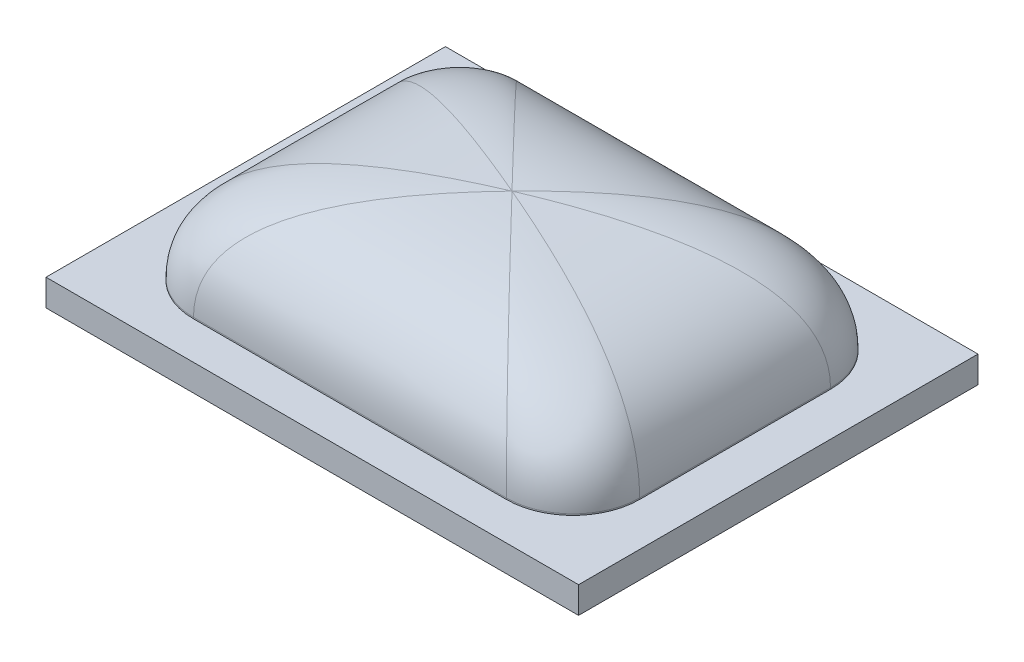
ISO-10303-21;
HEADER;
FILE_DESCRIPTION(('STEP AP214'),'2;1');
FILE_NAME('part.step','',(''),(''),'','','');
FILE_SCHEMA(('AUTOMOTIVE_DESIGN { 1 0 10303 214 1 1 1 1 }'));
ENDSEC;
DATA;
#1=APPLICATION_CONTEXT('core data for automotive mechanical design processes');
#2=APPLICATION_PROTOCOL_DEFINITION('international standard','automotive_design',2000,#1);
#3=PRODUCT_CONTEXT('',#1,'mechanical');
#4=PRODUCT('Part','Part','',(#3));
#5=PRODUCT_RELATED_PRODUCT_CATEGORY('part','',(#4));
#6=PRODUCT_DEFINITION_FORMATION('','',#4);
#7=PRODUCT_DEFINITION_CONTEXT('part definition',#1,'design');
#8=PRODUCT_DEFINITION('design','',#6,#7);
#9=PRODUCT_DEFINITION_SHAPE('','',#8);
#10=(LENGTH_UNIT() NAMED_UNIT(*) SI_UNIT(.MILLI.,.METRE.));
#11=(NAMED_UNIT(*) PLANE_ANGLE_UNIT() SI_UNIT($,.RADIAN.));
#12=(NAMED_UNIT(*) SI_UNIT($,.STERADIAN.) SOLID_ANGLE_UNIT());
#13=UNCERTAINTY_MEASURE_WITH_UNIT(LENGTH_MEASURE(1.E-05),#10,'distance_accuracy_value','');
#14=(GEOMETRIC_REPRESENTATION_CONTEXT(3) GLOBAL_UNCERTAINTY_ASSIGNED_CONTEXT((#13)) GLOBAL_UNIT_ASSIGNED_CONTEXT((#10,
#11,#12)) REPRESENTATION_CONTEXT('',''));
#15=CARTESIAN_POINT('',(0.,0.,0.));
#16=DIRECTION('',(0.,0.,1.));
#17=DIRECTION('',(1.,0.,0.));
#18=AXIS2_PLACEMENT_3D('',#15,#16,#17);
#19=CARTESIAN_POINT('',(0.,0.2,0.));
#20=DIRECTION('',(0.,1.,0.));
#21=DIRECTION('',(0.,0.,1.));
#22=AXIS2_PLACEMENT_3D('',#19,#20,#21);
#23=PLANE('',#22);
#24=DIRECTION('',(0.,0.,-1.));
#25=VECTOR('',#24,1.);
#26=CARTESIAN_POINT('',(2.,0.2,-1.5));
#27=LINE('',#26,#25);
#28=CARTESIAN_POINT('',(2.,0.2,1.5));
#29=VERTEX_POINT('',#28);
#30=CARTESIAN_POINT('',(2.,0.2,-1.5));
#31=VERTEX_POINT('',#30);
#32=EDGE_CURVE('E267',#29,#31,#27,.T.);
#33=ORIENTED_EDGE('',*,*,#32,.T.);
#34=DIRECTION('',(-1.,0.,0.));
#35=VECTOR('',#34,1.);
#36=CARTESIAN_POINT('',(-2.,0.2,-1.5));
#37=LINE('',#36,#35);
#38=CARTESIAN_POINT('',(-2.,0.2,-1.5));
#39=VERTEX_POINT('',#38);
#40=EDGE_CURVE('E86',#31,#39,#37,.T.);
#41=ORIENTED_EDGE('',*,*,#40,.T.);
#42=DIRECTION('',(0.,0.,1.));
#43=VECTOR('',#42,1.);
#44=CARTESIAN_POINT('',(-2.,0.2,-1.5));
#45=LINE('',#44,#43);
#46=CARTESIAN_POINT('',(-2.,0.2,1.5));
#47=VERTEX_POINT('',#46);
#48=EDGE_CURVE('E270',#39,#47,#45,.T.);
#49=ORIENTED_EDGE('',*,*,#48,.T.);
#50=DIRECTION('',(1.,0.,0.));
#51=VECTOR('',#50,1.);
#52=CARTESIAN_POINT('',(-2.,0.2,1.5));
#53=LINE('',#52,#51);
#54=EDGE_CURVE('E58',#47,#29,#53,.T.);
#55=ORIENTED_EDGE('',*,*,#54,.T.);
#56=EDGE_LOOP('',(#33,#41,#49,#55));
#57=FACE_BOUND('',#56,.T.);
#58=DIRECTION('',(-1.,0.,0.));
#59=VECTOR('',#58,1.);
#60=CARTESIAN_POINT('',(-1.17531980567757,0.2,-1.21705802677086));
#61=LINE('',#60,#59);
#62=CARTESIAN_POINT('',(1.17531980567757,0.2,-1.21705802677086));
#63=VERTEX_POINT('',#62);
#64=CARTESIAN_POINT('',(-1.17531980567757,0.2,-1.21705802677086));
#65=VERTEX_POINT('',#64);
#66=EDGE_CURVE('E155',#63,#65,#61,.T.);
#67=ORIENTED_EDGE('',*,*,#66,.F.);
#68=CARTESIAN_POINT('',(1.17531980567757,0.2,-0.717058026770856));
#69=DIRECTION('',(0.,1.,0.));
#70=DIRECTION('',(0.,0.,-1.));
#71=AXIS2_PLACEMENT_3D('',#68,#69,#70);
#72=CIRCLE('',#71,0.5);
#73=CARTESIAN_POINT('',(1.67531980567757,0.2,-0.717058026770853));
#74=VERTEX_POINT('',#73);
#75=EDGE_CURVE('E216',#74,#63,#72,.T.);
#76=ORIENTED_EDGE('',*,*,#75,.F.);
#77=DIRECTION('',(0.,0.,-1.));
#78=VECTOR('',#77,1.);
#79=CARTESIAN_POINT('',(1.67531980567757,0.2,-0.717058026770853));
#80=LINE('',#79,#78);
#81=CARTESIAN_POINT('',(1.67531980567757,0.2,0.717058026770853));
#82=VERTEX_POINT('',#81);
#83=EDGE_CURVE('E221',#82,#74,#80,.T.);
#84=ORIENTED_EDGE('',*,*,#83,.F.);
#85=CARTESIAN_POINT('',(1.17531980567757,0.2,0.717058026770856));
#86=DIRECTION('',(0.,1.,0.));
#87=DIRECTION('',(0.,0.,1.));
#88=AXIS2_PLACEMENT_3D('',#85,#86,#87);
#89=CIRCLE('',#88,0.5);
#90=CARTESIAN_POINT('',(1.17531980567757,0.2,1.21705802677086));
#91=VERTEX_POINT('',#90);
#92=EDGE_CURVE('E249',#91,#82,#89,.T.);
#93=ORIENTED_EDGE('',*,*,#92,.F.);
#94=DIRECTION('',(1.,0.,0.));
#95=VECTOR('',#94,1.);
#96=CARTESIAN_POINT('',(-1.17531980567757,0.2,1.21705802677086));
#97=LINE('',#96,#95);
#98=CARTESIAN_POINT('',(-1.17531980567757,0.2,1.21705802677086));
#99=VERTEX_POINT('',#98);
#100=EDGE_CURVE('E247',#99,#91,#97,.T.);
#101=ORIENTED_EDGE('',*,*,#100,.F.);
#102=CARTESIAN_POINT('',(-1.17531980567757,0.2,0.717058026770856));
#103=DIRECTION('',(0.,1.,0.));
#104=DIRECTION('',(0.,0.,1.));
#105=AXIS2_PLACEMENT_3D('',#102,#103,#104);
#106=CIRCLE('',#105,0.5);
#107=CARTESIAN_POINT('',(-1.67531980567757,0.2,0.717058026770853));
#108=VERTEX_POINT('',#107);
#109=EDGE_CURVE('E245',#108,#99,#106,.T.);
#110=ORIENTED_EDGE('',*,*,#109,.F.);
#111=DIRECTION('',(0.,0.,1.));
#112=VECTOR('',#111,1.);
#113=CARTESIAN_POINT('',(-1.67531980567757,0.2,-0.717058026770853));
#114=LINE('',#113,#112);
#115=CARTESIAN_POINT('',(-1.67531980567757,0.2,-0.717058026770853));
#116=VERTEX_POINT('',#115);
#117=EDGE_CURVE('E243',#116,#108,#114,.T.);
#118=ORIENTED_EDGE('',*,*,#117,.F.);
#119=CARTESIAN_POINT('',(-1.17531980567757,0.2,-0.717058026770856));
#120=DIRECTION('',(0.,1.,0.));
#121=DIRECTION('',(0.,0.,1.));
#122=AXIS2_PLACEMENT_3D('',#119,#120,#121);
#123=CIRCLE('',#122,0.5);
#124=EDGE_CURVE('E241',#65,#116,#123,.T.);
#125=ORIENTED_EDGE('',*,*,#124,.F.);
#126=EDGE_LOOP('',(#67,#76,#84,#93,#101,#110,#118,#125));
#127=FACE_BOUND('',#126,.T.);
#128=ADVANCED_FACE('F34',(#57,#127),#23,.T.);
#129=CARTESIAN_POINT('',(2.,0.2,-1.5));
#130=DIRECTION('',(-1.,0.,0.));
#131=DIRECTION('',(0.,0.,1.));
#132=AXIS2_PLACEMENT_3D('',#129,#130,#131);
#133=PLANE('',#132);
#134=DIRECTION('',(0.,0.,-1.));
#135=VECTOR('',#134,1.);
#136=CARTESIAN_POINT('',(2.,0.,-1.5));
#137=LINE('',#136,#135);
#138=CARTESIAN_POINT('',(2.,0.,1.5));
#139=VERTEX_POINT('',#138);
#140=CARTESIAN_POINT('',(2.,0.,-1.5));
#141=VERTEX_POINT('',#140);
#142=EDGE_CURVE('E266',#139,#141,#137,.T.);
#143=ORIENTED_EDGE('',*,*,#142,.T.);
#144=DIRECTION('',(0.,-1.,0.));
#145=VECTOR('',#144,1.);
#146=CARTESIAN_POINT('',(2.,0.2,-1.5));
#147=LINE('',#146,#145);
#148=EDGE_CURVE('E11',#31,#141,#147,.T.);
#149=ORIENTED_EDGE('',*,*,#148,.F.);
#150=ORIENTED_EDGE('',*,*,#32,.F.);
#151=DIRECTION('',(0.,-1.,0.));
#152=VECTOR('',#151,1.);
#153=CARTESIAN_POINT('',(2.,0.2,1.5));
#154=LINE('',#153,#152);
#155=EDGE_CURVE('E273',#29,#139,#154,.T.);
#156=ORIENTED_EDGE('',*,*,#155,.T.);
#157=EDGE_LOOP('',(#143,#149,#150,#156));
#158=FACE_BOUND('',#157,.T.);
#159=ADVANCED_FACE('F36',(#158),#133,.F.);
#160=CARTESIAN_POINT('',(-2.,0.2,-1.5));
#161=DIRECTION('',(0.,0.,1.));
#162=DIRECTION('',(1.,0.,0.));
#163=AXIS2_PLACEMENT_3D('',#160,#161,#162);
#164=PLANE('',#163);
#165=DIRECTION('',(-1.,0.,0.));
#166=VECTOR('',#165,1.);
#167=CARTESIAN_POINT('',(-2.,0.,-1.5));
#168=LINE('',#167,#166);
#169=CARTESIAN_POINT('',(-2.,0.,-1.5));
#170=VERTEX_POINT('',#169);
#171=EDGE_CURVE('E276',#141,#170,#168,.T.);
#172=ORIENTED_EDGE('',*,*,#171,.T.);
#173=DIRECTION('',(0.,-1.,0.));
#174=VECTOR('',#173,1.);
#175=CARTESIAN_POINT('',(-2.,0.2,-1.5));
#176=LINE('',#175,#174);
#177=EDGE_CURVE('E42',#39,#170,#176,.T.);
#178=ORIENTED_EDGE('',*,*,#177,.F.);
#179=ORIENTED_EDGE('',*,*,#40,.F.);
#180=ORIENTED_EDGE('',*,*,#148,.T.);
#181=EDGE_LOOP('',(#172,#178,#179,#180));
#182=FACE_BOUND('',#181,.T.);
#183=ADVANCED_FACE('F304',(#182),#164,.F.);
#184=CARTESIAN_POINT('',(-2.,0.2,-1.5));
#185=DIRECTION('',(1.,0.,0.));
#186=DIRECTION('',(0.,0.,-1.));
#187=AXIS2_PLACEMENT_3D('',#184,#185,#186);
#188=PLANE('',#187);
#189=DIRECTION('',(0.,0.,1.));
#190=VECTOR('',#189,1.);
#191=CARTESIAN_POINT('',(-2.,0.,-1.5));
#192=LINE('',#191,#190);
#193=CARTESIAN_POINT('',(-2.,0.,1.5));
#194=VERTEX_POINT('',#193);
#195=EDGE_CURVE('E278',#170,#194,#192,.T.);
#196=ORIENTED_EDGE('',*,*,#195,.T.);
#197=DIRECTION('',(0.,-1.,0.));
#198=VECTOR('',#197,1.);
#199=CARTESIAN_POINT('',(-2.,0.2,1.5));
#200=LINE('',#199,#198);
#201=EDGE_CURVE('E282',#47,#194,#200,.T.);
#202=ORIENTED_EDGE('',*,*,#201,.F.);
#203=ORIENTED_EDGE('',*,*,#48,.F.);
#204=ORIENTED_EDGE('',*,*,#177,.T.);
#205=EDGE_LOOP('',(#196,#202,#203,#204));
#206=FACE_BOUND('',#205,.T.);
#207=ADVANCED_FACE('F287',(#206),#188,.F.);
#208=CARTESIAN_POINT('',(-2.,0.2,1.5));
#209=DIRECTION('',(0.,0.,-1.));
#210=DIRECTION('',(-1.,0.,0.));
#211=AXIS2_PLACEMENT_3D('',#208,#209,#210);
#212=PLANE('',#211);
#213=DIRECTION('',(1.,0.,0.));
#214=VECTOR('',#213,1.);
#215=CARTESIAN_POINT('',(-2.,0.,1.5));
#216=LINE('',#215,#214);
#217=EDGE_CURVE('E79',#194,#139,#216,.T.);
#218=ORIENTED_EDGE('',*,*,#217,.T.);
#219=ORIENTED_EDGE('',*,*,#155,.F.);
#220=ORIENTED_EDGE('',*,*,#54,.F.);
#221=ORIENTED_EDGE('',*,*,#201,.T.);
#222=EDGE_LOOP('',(#218,#219,#220,#221));
#223=FACE_BOUND('',#222,.T.);
#224=ADVANCED_FACE('F295',(#223),#212,.F.);
#225=CARTESIAN_POINT('',(0.,0.,0.));
#226=DIRECTION('',(0.,1.,0.));
#227=DIRECTION('',(0.,0.,1.));
#228=AXIS2_PLACEMENT_3D('',#225,#226,#227);
#229=PLANE('',#228);
#230=ORIENTED_EDGE('',*,*,#142,.F.);
#231=ORIENTED_EDGE('',*,*,#217,.F.);
#232=ORIENTED_EDGE('',*,*,#195,.F.);
#233=ORIENTED_EDGE('',*,*,#171,.F.);
#234=EDGE_LOOP('',(#230,#231,#232,#233));
#235=FACE_BOUND('',#234,.T.);
#236=ADVANCED_FACE('F291',(#235),#229,.F.);
#237=CARTESIAN_POINT('',(1.17531980567757,0.21,-0.717058026770856));
#238=DIRECTION('',(0.,-1.,0.));
#239=DIRECTION('',(0.,0.,-1.));
#240=AXIS2_PLACEMENT_3D('',#237,#238,#239);
#241=CYLINDRICAL_SURFACE('',#240,0.5);
#242=ORIENTED_EDGE('',*,*,#75,.T.);
#243=DIRECTION('',(0.,-1.,0.));
#244=VECTOR('',#243,1.);
#245=CARTESIAN_POINT('',(1.17531980567757,0.21,-1.21705802677086));
#246=LINE('',#245,#244);
#247=CARTESIAN_POINT('',(1.17531980567757,0.21,-1.21705802677086));
#248=VERTEX_POINT('',#247);
#249=EDGE_CURVE('E156',#248,#63,#246,.T.);
#250=ORIENTED_EDGE('',*,*,#249,.F.);
#251=CARTESIAN_POINT('',(1.17531980567757,0.21,-0.717058026770856));
#252=DIRECTION('',(0.,1.,0.));
#253=DIRECTION('',(0.,0.,-1.));
#254=AXIS2_PLACEMENT_3D('',#251,#252,#253);
#255=CIRCLE('',#254,0.5);
#256=CARTESIAN_POINT('',(1.67531980567757,0.21,-0.717058026770853));
#257=VERTEX_POINT('',#256);
#258=EDGE_CURVE('E165',#257,#248,#255,.T.);
#259=ORIENTED_EDGE('',*,*,#258,.F.);
#260=DIRECTION('',(0.,-1.,0.));
#261=VECTOR('',#260,1.);
#262=CARTESIAN_POINT('',(1.67531980567757,0.21,-0.717058026770853));
#263=LINE('',#262,#261);
#264=EDGE_CURVE('E237',#257,#74,#263,.T.);
#265=ORIENTED_EDGE('',*,*,#264,.T.);
#266=EDGE_LOOP('',(#242,#250,#259,#265));
#267=FACE_BOUND('',#266,.T.);
#268=ADVANCED_FACE('F302',(#267),#241,.T.);
#269=CARTESIAN_POINT('',(-1.17531980567757,0.21,-1.21705802677086));
#270=DIRECTION('',(0.,0.,1.));
#271=DIRECTION('',(1.,0.,0.));
#272=AXIS2_PLACEMENT_3D('',#269,#270,#271);
#273=PLANE('',#272);
#274=ORIENTED_EDGE('',*,*,#66,.T.);
#275=DIRECTION('',(0.,-1.,0.));
#276=VECTOR('',#275,1.);
#277=CARTESIAN_POINT('',(-1.17531980567757,0.21,-1.21705802677086));
#278=LINE('',#277,#276);
#279=CARTESIAN_POINT('',(-1.17531980567757,0.21,-1.21705802677086));
#280=VERTEX_POINT('',#279);
#281=EDGE_CURVE('E138',#280,#65,#278,.T.);
#282=ORIENTED_EDGE('',*,*,#281,.F.);
#283=DIRECTION('',(-1.,0.,0.));
#284=VECTOR('',#283,1.);
#285=CARTESIAN_POINT('',(-1.17531980567757,0.21,-1.21705802677086));
#286=LINE('',#285,#284);
#287=EDGE_CURVE('E148',#248,#280,#286,.T.);
#288=ORIENTED_EDGE('',*,*,#287,.F.);
#289=ORIENTED_EDGE('',*,*,#249,.T.);
#290=EDGE_LOOP('',(#274,#282,#288,#289));
#291=FACE_BOUND('',#290,.T.);
#292=ADVANCED_FACE('F152',(#291),#273,.F.);
#293=CARTESIAN_POINT('',(-1.17531980567757,0.21,-0.717058026770856));
#294=DIRECTION('',(0.,-1.,0.));
#295=DIRECTION('',(0.,0.,-1.));
#296=AXIS2_PLACEMENT_3D('',#293,#294,#295);
#297=CYLINDRICAL_SURFACE('',#296,0.5);
#298=ORIENTED_EDGE('',*,*,#124,.T.);
#299=DIRECTION('',(0.,-1.,0.));
#300=VECTOR('',#299,1.);
#301=CARTESIAN_POINT('',(-1.67531980567757,0.21,-0.717058026770853));
#302=LINE('',#301,#300);
#303=CARTESIAN_POINT('',(-1.67531980567757,0.21,-0.717058026770853));
#304=VERTEX_POINT('',#303);
#305=EDGE_CURVE('E141',#304,#116,#302,.T.);
#306=ORIENTED_EDGE('',*,*,#305,.F.);
#307=CARTESIAN_POINT('',(-1.17531980567757,0.21,-0.717058026770856));
#308=DIRECTION('',(0.,1.,0.));
#309=DIRECTION('',(0.,0.,1.));
#310=AXIS2_PLACEMENT_3D('',#307,#308,#309);
#311=CIRCLE('',#310,0.5);
#312=EDGE_CURVE('E135',#280,#304,#311,.T.);
#313=ORIENTED_EDGE('',*,*,#312,.F.);
#314=ORIENTED_EDGE('',*,*,#281,.T.);
#315=EDGE_LOOP('',(#298,#306,#313,#314));
#316=FACE_BOUND('',#315,.T.);
#317=ADVANCED_FACE('F137',(#316),#297,.T.);
#318=CARTESIAN_POINT('',(-1.67531980567757,0.21,-0.717058026770853));
#319=DIRECTION('',(1.,0.,0.));
#320=DIRECTION('',(0.,0.,-1.));
#321=AXIS2_PLACEMENT_3D('',#318,#319,#320);
#322=PLANE('',#321);
#323=ORIENTED_EDGE('',*,*,#117,.T.);
#324=DIRECTION('',(0.,-1.,0.));
#325=VECTOR('',#324,1.);
#326=CARTESIAN_POINT('',(-1.67531980567757,0.21,0.717058026770853));
#327=LINE('',#326,#325);
#328=CARTESIAN_POINT('',(-1.67531980567757,0.21,0.717058026770853));
#329=VERTEX_POINT('',#328);
#330=EDGE_CURVE('E261',#329,#108,#327,.T.);
#331=ORIENTED_EDGE('',*,*,#330,.F.);
#332=DIRECTION('',(0.,0.,1.));
#333=VECTOR('',#332,1.);
#334=CARTESIAN_POINT('',(-1.67531980567757,0.21,-0.717058026770853));
#335=LINE('',#334,#333);
#336=EDGE_CURVE('E147',#304,#329,#335,.T.);
#337=ORIENTED_EDGE('',*,*,#336,.F.);
#338=ORIENTED_EDGE('',*,*,#305,.T.);
#339=EDGE_LOOP('',(#323,#331,#337,#338));
#340=FACE_BOUND('',#339,.T.);
#341=ADVANCED_FACE('F320',(#340),#322,.F.);
#342=CARTESIAN_POINT('',(-1.17531980567757,0.21,0.717058026770856));
#343=DIRECTION('',(0.,-1.,0.));
#344=DIRECTION('',(0.,0.,-1.));
#345=AXIS2_PLACEMENT_3D('',#342,#343,#344);
#346=CYLINDRICAL_SURFACE('',#345,0.5);
#347=ORIENTED_EDGE('',*,*,#109,.T.);
#348=DIRECTION('',(0.,-1.,0.));
#349=VECTOR('',#348,1.);
#350=CARTESIAN_POINT('',(-1.17531980567757,0.21,1.21705802677086));
#351=LINE('',#350,#349);
#352=CARTESIAN_POINT('',(-1.17531980567757,0.21,1.21705802677086));
#353=VERTEX_POINT('',#352);
#354=EDGE_CURVE('E258',#353,#99,#351,.T.);
#355=ORIENTED_EDGE('',*,*,#354,.F.);
#356=CARTESIAN_POINT('',(-1.17531980567757,0.21,0.717058026770856));
#357=DIRECTION('',(0.,1.,0.));
#358=DIRECTION('',(0.,0.,1.));
#359=AXIS2_PLACEMENT_3D('',#356,#357,#358);
#360=CIRCLE('',#359,0.5);
#361=EDGE_CURVE('E225',#329,#353,#360,.T.);
#362=ORIENTED_EDGE('',*,*,#361,.F.);
#363=ORIENTED_EDGE('',*,*,#330,.T.);
#364=EDGE_LOOP('',(#347,#355,#362,#363));
#365=FACE_BOUND('',#364,.T.);
#366=ADVANCED_FACE('F323',(#365),#346,.T.);
#367=CARTESIAN_POINT('',(-1.17531980567757,0.21,1.21705802677086));
#368=DIRECTION('',(0.,0.,-1.));
#369=DIRECTION('',(-1.,0.,0.));
#370=AXIS2_PLACEMENT_3D('',#367,#368,#369);
#371=PLANE('',#370);
#372=ORIENTED_EDGE('',*,*,#100,.T.);
#373=DIRECTION('',(0.,-1.,0.));
#374=VECTOR('',#373,1.);
#375=CARTESIAN_POINT('',(1.17531980567757,0.21,1.21705802677086));
#376=LINE('',#375,#374);
#377=CARTESIAN_POINT('',(1.17531980567757,0.21,1.21705802677086));
#378=VERTEX_POINT('',#377);
#379=EDGE_CURVE('E255',#378,#91,#376,.T.);
#380=ORIENTED_EDGE('',*,*,#379,.F.);
#381=DIRECTION('',(1.,0.,0.));
#382=VECTOR('',#381,1.);
#383=CARTESIAN_POINT('',(-1.17531980567757,0.21,1.21705802677086));
#384=LINE('',#383,#382);
#385=EDGE_CURVE('E228',#353,#378,#384,.T.);
#386=ORIENTED_EDGE('',*,*,#385,.F.);
#387=ORIENTED_EDGE('',*,*,#354,.T.);
#388=EDGE_LOOP('',(#372,#380,#386,#387));
#389=FACE_BOUND('',#388,.T.);
#390=ADVANCED_FACE('F327',(#389),#371,.F.);
#391=CARTESIAN_POINT('',(1.17531980567757,0.21,0.717058026770856));
#392=DIRECTION('',(0.,-1.,0.));
#393=DIRECTION('',(0.,0.,-1.));
#394=AXIS2_PLACEMENT_3D('',#391,#392,#393);
#395=CYLINDRICAL_SURFACE('',#394,0.5);
#396=ORIENTED_EDGE('',*,*,#92,.T.);
#397=DIRECTION('',(0.,-1.,0.));
#398=VECTOR('',#397,1.);
#399=CARTESIAN_POINT('',(1.67531980567757,0.21,0.717058026770853));
#400=LINE('',#399,#398);
#401=CARTESIAN_POINT('',(1.67531980567757,0.21,0.717058026770853));
#402=VERTEX_POINT('',#401);
#403=EDGE_CURVE('E49',#402,#82,#400,.T.);
#404=ORIENTED_EDGE('',*,*,#403,.F.);
#405=CARTESIAN_POINT('',(1.17531980567757,0.21,0.717058026770856));
#406=DIRECTION('',(0.,1.,0.));
#407=DIRECTION('',(0.,0.,1.));
#408=AXIS2_PLACEMENT_3D('',#405,#406,#407);
#409=CIRCLE('',#408,0.5);
#410=EDGE_CURVE('E231',#378,#402,#409,.T.);
#411=ORIENTED_EDGE('',*,*,#410,.F.);
#412=ORIENTED_EDGE('',*,*,#379,.T.);
#413=EDGE_LOOP('',(#396,#404,#411,#412));
#414=FACE_BOUND('',#413,.T.);
#415=ADVANCED_FACE('F331',(#414),#395,.T.);
#416=CARTESIAN_POINT('',(1.67531980567757,0.21,-0.717058026770853));
#417=DIRECTION('',(-1.,0.,0.));
#418=DIRECTION('',(0.,0.,1.));
#419=AXIS2_PLACEMENT_3D('',#416,#417,#418);
#420=PLANE('',#419);
#421=ORIENTED_EDGE('',*,*,#83,.T.);
#422=ORIENTED_EDGE('',*,*,#264,.F.);
#423=DIRECTION('',(0.,0.,-1.));
#424=VECTOR('',#423,1.);
#425=CARTESIAN_POINT('',(1.67531980567757,0.21,-0.717058026770853));
#426=LINE('',#425,#424);
#427=EDGE_CURVE('E234',#402,#257,#426,.T.);
#428=ORIENTED_EDGE('',*,*,#427,.F.);
#429=ORIENTED_EDGE('',*,*,#403,.T.);
#430=EDGE_LOOP('',(#421,#422,#428,#429));
#431=FACE_BOUND('',#430,.T.);
#432=ADVANCED_FACE('F335',(#431),#420,.F.);
#433=CARTESIAN_POINT('',(1.67531980567757,0.21,-0.717058026770853));
#434=CARTESIAN_POINT('',(1.67531980567757,1.01,-0.717058026770853));
#435=CARTESIAN_POINT('',(0.,1.01,0.));
#436=CARTESIAN_POINT('',(1.67531980567757,0.21,-1.00995124558431));
#437=CARTESIAN_POINT('',(1.67531980567757,1.01,-1.00995124558431));
#438=CARTESIAN_POINT('',(0.,1.01,0.));
#439=CARTESIAN_POINT('',(1.46821302449102,0.21,-1.21705802677086));
#440=CARTESIAN_POINT('',(1.46821302449102,1.01,-1.21705802677086));
#441=CARTESIAN_POINT('',(0.,1.01,0.));
#442=CARTESIAN_POINT('',(1.17531980567757,0.21,-1.21705802677086));
#443=CARTESIAN_POINT('',(1.17531980567757,1.01,-1.21705802677086));
#444=CARTESIAN_POINT('',(0.,1.01,0.));
#445=(BOUNDED_SURFACE() B_SPLINE_SURFACE(3,2,((#433,#434,#435),(#436,#437,#438),(#439,#440,
#441),(#442,#443,#444)),.UNSPECIFIED.,.F.,.F.,.F.) B_SPLINE_SURFACE_WITH_KNOTS((4,4),(3,3),(0.,
1.),(0.,1.),.UNSPECIFIED.) GEOMETRIC_REPRESENTATION_ITEM() RATIONAL_B_SPLINE_SURFACE(((1.,1.,
1.),(0.804737854124363,0.804737854124363,0.804737854124363),(0.804737854124363,
0.804737854124363,0.804737854124363),(1.,1.,1.))) REPRESENTATION_ITEM('') SURFACE());
#446=CARTESIAN_POINT('',(1.17531980567757,0.21,-1.21705802677086));
#447=CARTESIAN_POINT('',(1.17531980567757,1.01,-1.21705802677086));
#448=CARTESIAN_POINT('',(0.,1.01,0.));
#449=(BOUNDED_CURVE() B_SPLINE_CURVE(2,(#446,#447,#448),.UNSPECIFIED.,.F.,
.F.) B_SPLINE_CURVE_WITH_KNOTS((3,3),(0.,1.),
.UNSPECIFIED.) CURVE() GEOMETRIC_REPRESENTATION_ITEM() RATIONAL_B_SPLINE_CURVE((1.,1.,1.)) REPRESENTATION_ITEM(''));
#450=CARTESIAN_POINT('',(0.,1.01,0.));
#451=VERTEX_POINT('',#450);
#452=EDGE_CURVE('E164',#248,#451,#449,.T.);
#453=CARTESIAN_POINT('',(1.67531980567757,0.21,-0.717058026770853));
#454=CARTESIAN_POINT('',(1.67531980567757,1.01,-0.717058026770853));
#455=CARTESIAN_POINT('',(0.,1.01,0.));
#456=(BOUNDED_CURVE() B_SPLINE_CURVE(2,(#453,#454,#455),.UNSPECIFIED.,.F.,
.F.) B_SPLINE_CURVE_WITH_KNOTS((3,3),(0.,1.),
.UNSPECIFIED.) CURVE() GEOMETRIC_REPRESENTATION_ITEM() RATIONAL_B_SPLINE_CURVE((1.,1.,1.)) REPRESENTATION_ITEM(''));
#457=EDGE_CURVE('E173',#451,#257,#456,.F.);
#458=ORIENTED_EDGE('',*,*,#258,.T.);
#459=ORIENTED_EDGE('',*,*,#452,.T.);
#460=ORIENTED_EDGE('',*,*,#457,.T.);
#461=EDGE_LOOP('',(#458,#459,#460));
#462=FACE_BOUND('',#461,.T.);
#463=ADVANCED_FACE('F339',(#462),#445,.T.);
#464=CARTESIAN_POINT('',(1.17531980567757,0.21,-1.21705802677086));
#465=CARTESIAN_POINT('',(1.17531980567757,1.01,-1.21705802677086));
#466=CARTESIAN_POINT('',(0.,1.01,0.));
#467=CARTESIAN_POINT('',(-1.17531980567757,0.21,-1.21705802677086));
#468=CARTESIAN_POINT('',(-1.17531980567757,1.01,-1.21705802677086));
#469=CARTESIAN_POINT('',(0.,1.01,0.));
#470=(BOUNDED_SURFACE() B_SPLINE_SURFACE(1,2,((#464,#465,#466),(#467,#468,#469)),.UNSPECIFIED.,
.F.,.F.,.F.) B_SPLINE_SURFACE_WITH_KNOTS((2,2),(3,3),(0.,1.),(0.,1.),
.UNSPECIFIED.) GEOMETRIC_REPRESENTATION_ITEM() RATIONAL_B_SPLINE_SURFACE(((1.,1.,1.),(1.,1.,1.))) REPRESENTATION_ITEM('') SURFACE());
#471=CARTESIAN_POINT('',(-1.17531980567757,0.21,-1.21705802677086));
#472=CARTESIAN_POINT('',(-1.17531980567757,1.01,-1.21705802677086));
#473=CARTESIAN_POINT('',(0.,1.01,0.));
#474=(BOUNDED_CURVE() B_SPLINE_CURVE(2,(#471,#472,#473),.UNSPECIFIED.,.F.,
.F.) B_SPLINE_CURVE_WITH_KNOTS((3,3),(0.,1.),
.UNSPECIFIED.) CURVE() GEOMETRIC_REPRESENTATION_ITEM() RATIONAL_B_SPLINE_CURVE((1.,1.,1.)) REPRESENTATION_ITEM(''));
#475=EDGE_CURVE('E162',#280,#451,#474,.T.);
#476=ORIENTED_EDGE('',*,*,#287,.T.);
#477=ORIENTED_EDGE('',*,*,#475,.T.);
#478=ORIENTED_EDGE('',*,*,#452,.F.);
#479=EDGE_LOOP('',(#476,#477,#478));
#480=FACE_BOUND('',#479,.T.);
#481=ADVANCED_FACE('F161',(#480),#470,.T.);
#482=CARTESIAN_POINT('',(1.67531980567757,0.21,0.717058026770853));
#483=CARTESIAN_POINT('',(1.67531980567757,1.01,0.717058026770853));
#484=CARTESIAN_POINT('',(0.,1.01,0.));
#485=CARTESIAN_POINT('',(1.67531980567757,0.21,-0.717058026770853));
#486=CARTESIAN_POINT('',(1.67531980567757,1.01,-0.717058026770853));
#487=CARTESIAN_POINT('',(0.,1.01,0.));
#488=(BOUNDED_SURFACE() B_SPLINE_SURFACE(1,2,((#482,#483,#484),(#485,#486,#487)),.UNSPECIFIED.,
.F.,.F.,.F.) B_SPLINE_SURFACE_WITH_KNOTS((2,2),(3,3),(0.,1.),(0.,1.),
.UNSPECIFIED.) GEOMETRIC_REPRESENTATION_ITEM() RATIONAL_B_SPLINE_SURFACE(((1.,1.,1.),(1.,1.,1.))) REPRESENTATION_ITEM('') SURFACE());
#489=CARTESIAN_POINT('',(1.67531980567757,0.21,0.717058026770853));
#490=CARTESIAN_POINT('',(1.67531980567757,1.01,0.717058026770853));
#491=CARTESIAN_POINT('',(0.,1.01,0.));
#492=(BOUNDED_CURVE() B_SPLINE_CURVE(2,(#489,#490,#491),.UNSPECIFIED.,.F.,
.F.) B_SPLINE_CURVE_WITH_KNOTS((3,3),(0.,1.),
.UNSPECIFIED.) CURVE() GEOMETRIC_REPRESENTATION_ITEM() RATIONAL_B_SPLINE_CURVE((1.,1.,1.)) REPRESENTATION_ITEM(''));
#493=EDGE_CURVE('E208',#402,#451,#492,.T.);
#494=ORIENTED_EDGE('',*,*,#427,.T.);
#495=ORIENTED_EDGE('',*,*,#457,.F.);
#496=ORIENTED_EDGE('',*,*,#493,.F.);
#497=EDGE_LOOP('',(#494,#495,#496));
#498=FACE_BOUND('',#497,.T.);
#499=ADVANCED_FACE('F388',(#498),#488,.T.);
#500=CARTESIAN_POINT('',(-1.17531980567757,0.21,-1.21705802677086));
#501=CARTESIAN_POINT('',(-1.17531980567757,1.01,-1.21705802677086));
#502=CARTESIAN_POINT('',(0.,1.01,0.));
#503=CARTESIAN_POINT('',(-1.46821302449102,0.21,-1.21705802677086));
#504=CARTESIAN_POINT('',(-1.46821302449102,1.01,-1.21705802677086));
#505=CARTESIAN_POINT('',(0.,1.01,0.));
#506=CARTESIAN_POINT('',(-1.67531980567757,0.21,-1.00995124558431));
#507=CARTESIAN_POINT('',(-1.67531980567757,1.01,-1.00995124558431));
#508=CARTESIAN_POINT('',(0.,1.01,0.));
#509=CARTESIAN_POINT('',(-1.67531980567757,0.21,-0.717058026770853));
#510=CARTESIAN_POINT('',(-1.67531980567757,1.01,-0.717058026770853));
#511=CARTESIAN_POINT('',(0.,1.01,0.));
#512=(BOUNDED_SURFACE() B_SPLINE_SURFACE(3,2,((#500,#501,#502),(#503,#504,#505),(#506,#507,
#508),(#509,#510,#511)),.UNSPECIFIED.,.F.,.F.,.F.) B_SPLINE_SURFACE_WITH_KNOTS((4,4),(3,3),(0.,
1.),(0.,1.),.UNSPECIFIED.) GEOMETRIC_REPRESENTATION_ITEM() RATIONAL_B_SPLINE_SURFACE(((1.,1.,
1.),(0.804737854124362,0.804737854124362,0.804737854124362),(0.804737854124362,
0.804737854124362,0.804737854124362),(1.,1.,1.))) REPRESENTATION_ITEM('') SURFACE());
#513=CARTESIAN_POINT('',(-1.67531980567757,0.21,-0.717058026770853));
#514=CARTESIAN_POINT('',(-1.67531980567757,1.01,-0.717058026770853));
#515=CARTESIAN_POINT('',(0.,1.01,0.));
#516=(BOUNDED_CURVE() B_SPLINE_CURVE(2,(#513,#514,#515),.UNSPECIFIED.,.F.,
.F.) B_SPLINE_CURVE_WITH_KNOTS((3,3),(0.,1.),
.UNSPECIFIED.) CURVE() GEOMETRIC_REPRESENTATION_ITEM() RATIONAL_B_SPLINE_CURVE((1.,1.,1.)) REPRESENTATION_ITEM(''));
#517=EDGE_CURVE('E168',#304,#451,#516,.T.);
#518=ORIENTED_EDGE('',*,*,#312,.T.);
#519=ORIENTED_EDGE('',*,*,#517,.T.);
#520=ORIENTED_EDGE('',*,*,#475,.F.);
#521=EDGE_LOOP('',(#518,#519,#520));
#522=FACE_BOUND('',#521,.T.);
#523=ADVANCED_FACE('F167',(#522),#512,.T.);
#524=CARTESIAN_POINT('',(-1.67531980567757,0.21,-0.717058026770853));
#525=CARTESIAN_POINT('',(-1.67531980567757,1.01,-0.717058026770853));
#526=CARTESIAN_POINT('',(0.,1.01,0.));
#527=CARTESIAN_POINT('',(-1.67531980567757,0.21,0.717058026770853));
#528=CARTESIAN_POINT('',(-1.67531980567757,1.01,0.717058026770853));
#529=CARTESIAN_POINT('',(0.,1.01,0.));
#530=(BOUNDED_SURFACE() B_SPLINE_SURFACE(1,2,((#524,#525,#526),(#527,#528,#529)),.UNSPECIFIED.,
.F.,.F.,.F.) B_SPLINE_SURFACE_WITH_KNOTS((2,2),(3,3),(0.,1.),(0.,1.),
.UNSPECIFIED.) GEOMETRIC_REPRESENTATION_ITEM() RATIONAL_B_SPLINE_SURFACE(((1.,1.,1.),(1.,1.,1.))) REPRESENTATION_ITEM('') SURFACE());
#531=CARTESIAN_POINT('',(-1.67531980567757,0.21,0.717058026770853));
#532=CARTESIAN_POINT('',(-1.67531980567757,1.01,0.717058026770853));
#533=CARTESIAN_POINT('',(0.,1.01,0.));
#534=(BOUNDED_CURVE() B_SPLINE_CURVE(2,(#531,#532,#533),.UNSPECIFIED.,.F.,
.F.) B_SPLINE_CURVE_WITH_KNOTS((3,3),(0.,1.),
.UNSPECIFIED.) CURVE() GEOMETRIC_REPRESENTATION_ITEM() RATIONAL_B_SPLINE_CURVE((1.,1.,1.)) REPRESENTATION_ITEM(''));
#535=EDGE_CURVE('E171',#329,#451,#534,.T.);
#536=ORIENTED_EDGE('',*,*,#336,.T.);
#537=ORIENTED_EDGE('',*,*,#535,.T.);
#538=ORIENTED_EDGE('',*,*,#517,.F.);
#539=EDGE_LOOP('',(#536,#537,#538));
#540=FACE_BOUND('',#539,.T.);
#541=ADVANCED_FACE('F367',(#540),#530,.T.);
#542=CARTESIAN_POINT('',(-1.67531980567757,0.21,0.717058026770852));
#543=CARTESIAN_POINT('',(-1.67531980567757,1.01,0.717058026770852));
#544=CARTESIAN_POINT('',(0.,1.01,0.));
#545=CARTESIAN_POINT('',(-1.67531980567757,0.21,1.00995124558431));
#546=CARTESIAN_POINT('',(-1.67531980567757,1.01,1.00995124558431));
#547=CARTESIAN_POINT('',(0.,1.01,0.));
#548=CARTESIAN_POINT('',(-1.46821302449102,0.21,1.21705802677086));
#549=CARTESIAN_POINT('',(-1.46821302449102,1.01,1.21705802677086));
#550=CARTESIAN_POINT('',(0.,1.01,0.));
#551=CARTESIAN_POINT('',(-1.17531980567757,0.21,1.21705802677086));
#552=CARTESIAN_POINT('',(-1.17531980567757,1.01,1.21705802677086));
#553=CARTESIAN_POINT('',(0.,1.01,0.));
#554=(BOUNDED_SURFACE() B_SPLINE_SURFACE(3,2,((#542,#543,#544),(#545,#546,#547),(#548,#549,
#550),(#551,#552,#553)),.UNSPECIFIED.,.F.,.F.,.F.) B_SPLINE_SURFACE_WITH_KNOTS((4,4),(3,3),(0.,
1.),(0.,1.),.UNSPECIFIED.) GEOMETRIC_REPRESENTATION_ITEM() RATIONAL_B_SPLINE_SURFACE(((1.,1.,
1.),(0.804737854124363,0.804737854124363,0.804737854124363),(0.804737854124363,
0.804737854124363,0.804737854124363),(1.,1.,1.))) REPRESENTATION_ITEM('') SURFACE());
#555=CARTESIAN_POINT('',(-1.17531980567757,0.21,1.21705802677086));
#556=CARTESIAN_POINT('',(-1.17531980567757,1.01,1.21705802677086));
#557=CARTESIAN_POINT('',(0.,1.01,0.));
#558=(BOUNDED_CURVE() B_SPLINE_CURVE(2,(#555,#556,#557),.UNSPECIFIED.,.F.,
.F.) B_SPLINE_CURVE_WITH_KNOTS((3,3),(0.,1.),
.UNSPECIFIED.) CURVE() GEOMETRIC_REPRESENTATION_ITEM() RATIONAL_B_SPLINE_CURVE((1.,1.,1.)) REPRESENTATION_ITEM(''));
#559=EDGE_CURVE('E192',#353,#451,#558,.T.);
#560=ORIENTED_EDGE('',*,*,#361,.T.);
#561=ORIENTED_EDGE('',*,*,#559,.T.);
#562=ORIENTED_EDGE('',*,*,#535,.F.);
#563=EDGE_LOOP('',(#560,#561,#562));
#564=FACE_BOUND('',#563,.T.);
#565=ADVANCED_FACE('F356',(#564),#554,.T.);
#566=CARTESIAN_POINT('',(-1.17531980567757,0.21,1.21705802677086));
#567=CARTESIAN_POINT('',(-1.17531980567757,1.01,1.21705802677086));
#568=CARTESIAN_POINT('',(0.,1.01,0.));
#569=CARTESIAN_POINT('',(1.17531980567757,0.21,1.21705802677086));
#570=CARTESIAN_POINT('',(1.17531980567757,1.01,1.21705802677086));
#571=CARTESIAN_POINT('',(0.,1.01,0.));
#572=(BOUNDED_SURFACE() B_SPLINE_SURFACE(1,2,((#566,#567,#568),(#569,#570,#571)),.UNSPECIFIED.,
.F.,.F.,.F.) B_SPLINE_SURFACE_WITH_KNOTS((2,2),(3,3),(0.,1.),(0.,1.),
.UNSPECIFIED.) GEOMETRIC_REPRESENTATION_ITEM() RATIONAL_B_SPLINE_SURFACE(((1.,1.,1.),(1.,1.,1.))) REPRESENTATION_ITEM('') SURFACE());
#573=CARTESIAN_POINT('',(1.17531980567757,0.21,1.21705802677086));
#574=CARTESIAN_POINT('',(1.17531980567757,1.01,1.21705802677086));
#575=CARTESIAN_POINT('',(0.,1.01,0.));
#576=(BOUNDED_CURVE() B_SPLINE_CURVE(2,(#573,#574,#575),.UNSPECIFIED.,.F.,
.F.) B_SPLINE_CURVE_WITH_KNOTS((3,3),(0.,1.),
.UNSPECIFIED.) CURVE() GEOMETRIC_REPRESENTATION_ITEM() RATIONAL_B_SPLINE_CURVE((1.,1.,1.)) REPRESENTATION_ITEM(''));
#577=EDGE_CURVE('E200',#378,#451,#576,.T.);
#578=ORIENTED_EDGE('',*,*,#385,.T.);
#579=ORIENTED_EDGE('',*,*,#577,.T.);
#580=ORIENTED_EDGE('',*,*,#559,.F.);
#581=EDGE_LOOP('',(#578,#579,#580));
#582=FACE_BOUND('',#581,.T.);
#583=ADVANCED_FACE('F345',(#582),#572,.T.);
#584=CARTESIAN_POINT('',(1.17531980567757,0.21,1.21705802677086));
#585=CARTESIAN_POINT('',(1.17531980567757,1.01,1.21705802677086));
#586=CARTESIAN_POINT('',(0.,1.01,0.));
#587=CARTESIAN_POINT('',(1.46821302449102,0.21,1.21705802677086));
#588=CARTESIAN_POINT('',(1.46821302449102,1.01,1.21705802677086));
#589=CARTESIAN_POINT('',(0.,1.01,0.));
#590=CARTESIAN_POINT('',(1.67531980567757,0.21,1.00995124558431));
#591=CARTESIAN_POINT('',(1.67531980567757,1.01,1.00995124558431));
#592=CARTESIAN_POINT('',(0.,1.01,0.));
#593=CARTESIAN_POINT('',(1.67531980567757,0.21,0.717058026770853));
#594=CARTESIAN_POINT('',(1.67531980567757,1.01,0.717058026770853));
#595=CARTESIAN_POINT('',(0.,1.01,0.));
#596=(BOUNDED_SURFACE() B_SPLINE_SURFACE(3,2,((#584,#585,#586),(#587,#588,#589),(#590,#591,
#592),(#593,#594,#595)),.UNSPECIFIED.,.F.,.F.,.F.) B_SPLINE_SURFACE_WITH_KNOTS((4,4),(3,3),(0.,
1.),(0.,1.),.UNSPECIFIED.) GEOMETRIC_REPRESENTATION_ITEM() RATIONAL_B_SPLINE_SURFACE(((1.,1.,
1.),(0.804737854124362,0.804737854124362,0.804737854124362),(0.804737854124362,
0.804737854124362,0.804737854124362),(1.,1.,1.))) REPRESENTATION_ITEM('') SURFACE());
#597=ORIENTED_EDGE('',*,*,#410,.T.);
#598=ORIENTED_EDGE('',*,*,#493,.T.);
#599=ORIENTED_EDGE('',*,*,#577,.F.);
#600=EDGE_LOOP('',(#597,#598,#599));
#601=FACE_BOUND('',#600,.T.);
#602=ADVANCED_FACE('F340',(#601),#596,.T.);
#603=CLOSED_SHELL('',(#128,#159,#183,#207,#224,#236,#268,#292,#317,#341,#366,#390,#415,#432,
#463,#481,#499,#523,#541,#565,#583,#602));
#604=MANIFOLD_SOLID_BREP('B2',#603);
#605=ADVANCED_BREP_SHAPE_REPRESENTATION('',(#18,#604),#14);
#606=SHAPE_DEFINITION_REPRESENTATION(#9,#605);
ENDSEC;
END-ISO-10303-21;
